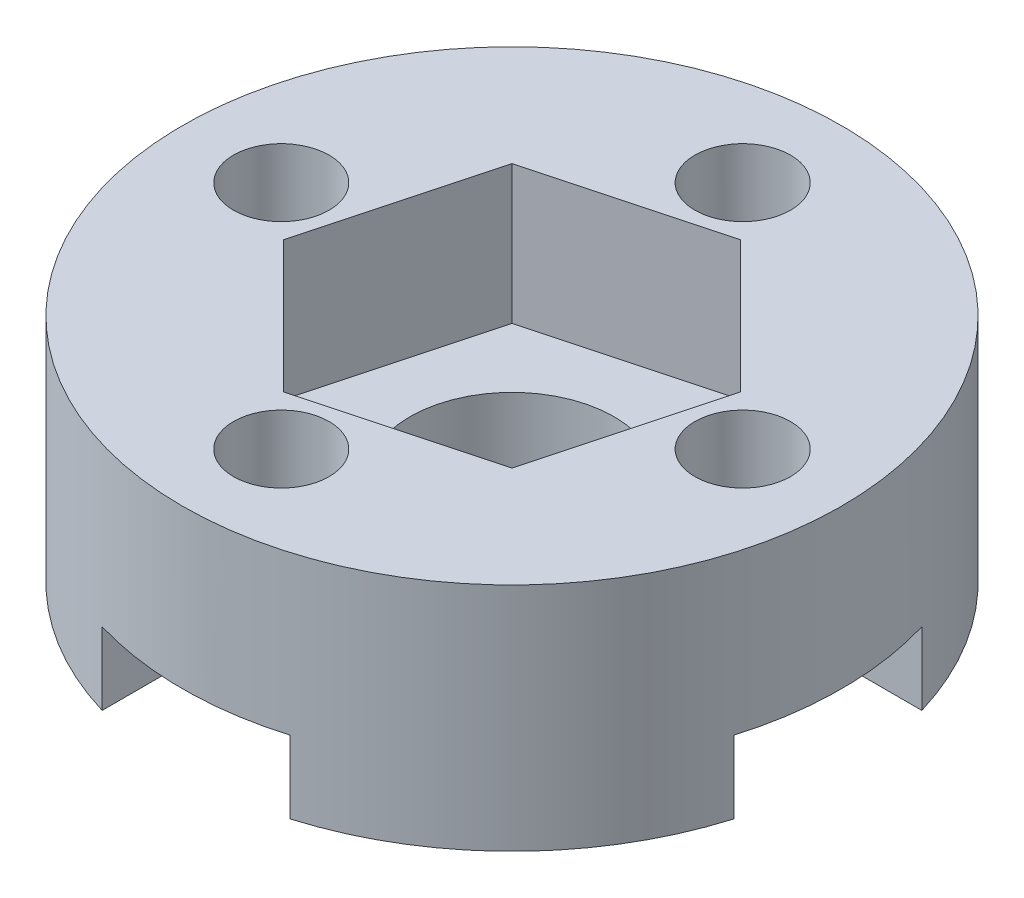
ISO-10303-21;
HEADER;
FILE_DESCRIPTION(('STEP AP214'),'2;1');
FILE_NAME('part.step','',(''),(''),'','','');
FILE_SCHEMA(('AUTOMOTIVE_DESIGN { 1 0 10303 214 1 1 1 1 }'));
ENDSEC;
DATA;
#1=APPLICATION_CONTEXT('core data for automotive mechanical design processes');
#2=APPLICATION_PROTOCOL_DEFINITION('international standard','automotive_design',2000,#1);
#3=PRODUCT_CONTEXT('',#1,'mechanical');
#4=PRODUCT('Part','Part','',(#3));
#5=PRODUCT_RELATED_PRODUCT_CATEGORY('part','',(#4));
#6=PRODUCT_DEFINITION_FORMATION('','',#4);
#7=PRODUCT_DEFINITION_CONTEXT('part definition',#1,'design');
#8=PRODUCT_DEFINITION('design','',#6,#7);
#9=PRODUCT_DEFINITION_SHAPE('','',#8);
#10=(LENGTH_UNIT() NAMED_UNIT(*) SI_UNIT(.MILLI.,.METRE.));
#11=(NAMED_UNIT(*) PLANE_ANGLE_UNIT() SI_UNIT($,.RADIAN.));
#12=(NAMED_UNIT(*) SI_UNIT($,.STERADIAN.) SOLID_ANGLE_UNIT());
#13=UNCERTAINTY_MEASURE_WITH_UNIT(LENGTH_MEASURE(1.E-05),#10,'distance_accuracy_value','');
#14=(GEOMETRIC_REPRESENTATION_CONTEXT(3) GLOBAL_UNCERTAINTY_ASSIGNED_CONTEXT((#13)) GLOBAL_UNIT_ASSIGNED_CONTEXT((#10,
#11,#12)) REPRESENTATION_CONTEXT('',''));
#15=CARTESIAN_POINT('',(0.,0.,0.));
#16=DIRECTION('',(0.,0.,1.));
#17=DIRECTION('',(1.,0.,0.));
#18=AXIS2_PLACEMENT_3D('',#15,#16,#17);
#19=CARTESIAN_POINT('',(0.,7.,0.));
#20=DIRECTION('',(0.,-1.,0.));
#21=DIRECTION('',(0.,0.,-1.));
#22=AXIS2_PLACEMENT_3D('',#19,#20,#21);
#23=CYLINDRICAL_SURFACE('',#22,3.1);
#24=CARTESIAN_POINT('',(0.,-1.,0.));
#25=DIRECTION('',(0.,-1.,0.));
#26=DIRECTION('',(0.,0.,-1.));
#27=AXIS2_PLACEMENT_3D('',#24,#25,#26);
#28=CIRCLE('',#27,3.1);
#29=CARTESIAN_POINT('',(0.,-1.,-3.1));
#30=VERTEX_POINT('',#29);
#31=EDGE_CURVE('E419',#30,#30,#28,.T.);
#32=ORIENTED_EDGE('',*,*,#31,.T.);
#33=EDGE_LOOP('',(#32));
#34=FACE_BOUND('',#33,.T.);
#35=CARTESIAN_POINT('',(0.,2.8,0.));
#36=DIRECTION('',(0.,1.,0.));
#37=DIRECTION('',(0.,0.,1.));
#38=AXIS2_PLACEMENT_3D('',#35,#36,#37);
#39=CIRCLE('',#38,3.1);
#40=CARTESIAN_POINT('',(0.,2.8,3.1));
#41=VERTEX_POINT('',#40);
#42=EDGE_CURVE('E39',#41,#41,#39,.T.);
#43=ORIENTED_EDGE('',*,*,#42,.T.);
#44=EDGE_LOOP('',(#43));
#45=FACE_BOUND('',#44,.T.);
#46=ADVANCED_FACE('F35',(#34,#45),#23,.F.);
#47=CARTESIAN_POINT('',(0.,0.,0.));
#48=DIRECTION('',(0.,1.,0.));
#49=DIRECTION('',(0.,0.,1.));
#50=AXIS2_PLACEMENT_3D('',#47,#48,#49);
#51=PLANE('',#50);
#52=DIRECTION('',(1.,0.,0.));
#53=VECTOR('',#52,1.);
#54=CARTESIAN_POINT('',(0.,0.,-2.85));
#55=LINE('',#54,#53);
#56=CARTESIAN_POINT('',(-9.58527516558604,0.,-2.8499999999999));
#57=VERTEX_POINT('',#56);
#58=CARTESIAN_POINT('',(-7.00000000000003,0.,-2.84999999999993));
#59=VERTEX_POINT('',#58);
#60=EDGE_CURVE('E417',#57,#59,#55,.T.);
#61=ORIENTED_EDGE('',*,*,#60,.F.);
#62=CARTESIAN_POINT('',(0.,0.,0.));
#63=DIRECTION('',(0.,1.,0.));
#64=DIRECTION('',(0.,0.,1.));
#65=AXIS2_PLACEMENT_3D('',#62,#63,#64);
#66=CIRCLE('',#65,10.);
#67=CARTESIAN_POINT('',(-2.85000000000007,0.,-9.58527516558599));
#68=VERTEX_POINT('',#67);
#69=EDGE_CURVE('E570',#68,#57,#66,.T.);
#70=ORIENTED_EDGE('',*,*,#69,.F.);
#71=DIRECTION('',(0.,0.,1.));
#72=VECTOR('',#71,1.);
#73=CARTESIAN_POINT('',(-2.85,0.,0.));
#74=LINE('',#73,#72);
#75=CARTESIAN_POINT('',(-2.85000000000005,0.,-6.99999999999998));
#76=VERTEX_POINT('',#75);
#77=EDGE_CURVE('E398',#68,#76,#74,.T.);
#78=ORIENTED_EDGE('',*,*,#77,.T.);
#79=CARTESIAN_POINT('',(0.,0.,-7.));
#80=DIRECTION('',(0.,1.,0.));
#81=DIRECTION('',(0.,0.,1.));
#82=AXIS2_PLACEMENT_3D('',#79,#80,#81);
#83=CIRCLE('',#82,2.85);
#84=CARTESIAN_POINT('',(-1.91425426413401,0.,-4.88857142857142));
#85=VERTEX_POINT('',#84);
#86=EDGE_CURVE('E387',#76,#85,#83,.T.);
#87=ORIENTED_EDGE('',*,*,#86,.T.);
#88=CARTESIAN_POINT('',(0.,0.,0.));
#89=DIRECTION('',(0.,1.,0.));
#90=DIRECTION('',(0.,0.,1.));
#91=AXIS2_PLACEMENT_3D('',#88,#89,#90);
#92=CIRCLE('',#91,5.25);
#93=CARTESIAN_POINT('',(-4.88857142857145,0.,-1.91425426413392));
#94=VERTEX_POINT('',#93);
#95=EDGE_CURVE('E452',#94,#85,#92,.F.);
#96=ORIENTED_EDGE('',*,*,#95,.F.);
#97=CARTESIAN_POINT('',(-7.,0.,0.));
#98=DIRECTION('',(0.,1.,0.));
#99=DIRECTION('',(0.,0.,1.));
#100=AXIS2_PLACEMENT_3D('',#97,#98,#99);
#101=CIRCLE('',#100,2.85);
#102=EDGE_CURVE('E394',#94,#59,#101,.T.);
#103=ORIENTED_EDGE('',*,*,#102,.T.);
#104=EDGE_LOOP('',(#61,#70,#78,#87,#96,#103));
#105=FACE_BOUND('',#104,.T.);
#106=ADVANCED_FACE('F569',(#105),#51,.F.);
#107=CARTESIAN_POINT('',(2.85,0.,9.58527516558601));
#108=VERTEX_POINT('',#107);
#109=CARTESIAN_POINT('',(9.58527516558602,0.,2.84999999999997));
#110=VERTEX_POINT('',#109);
#111=EDGE_CURVE('E444',#108,#110,#66,.T.);
#112=ORIENTED_EDGE('',*,*,#111,.F.);
#113=DIRECTION('',(0.,0.,-1.));
#114=VECTOR('',#113,1.);
#115=CARTESIAN_POINT('',(2.85,0.,0.));
#116=LINE('',#115,#114);
#117=CARTESIAN_POINT('',(2.85,0.,7.));
#118=VERTEX_POINT('',#117);
#119=EDGE_CURVE('E411',#108,#118,#116,.T.);
#120=ORIENTED_EDGE('',*,*,#119,.T.);
#121=CARTESIAN_POINT('',(0.,0.,7.));
#122=DIRECTION('',(0.,1.,0.));
#123=DIRECTION('',(0.,0.,1.));
#124=AXIS2_PLACEMENT_3D('',#121,#122,#123);
#125=CIRCLE('',#124,2.85);
#126=CARTESIAN_POINT('',(1.91425426413397,0.,4.88857142857143));
#127=VERTEX_POINT('',#126);
#128=EDGE_CURVE('E393',#118,#127,#125,.T.);
#129=ORIENTED_EDGE('',*,*,#128,.T.);
#130=CARTESIAN_POINT('',(4.88857142857144,0.,1.91425426413396));
#131=VERTEX_POINT('',#130);
#132=EDGE_CURVE('E443',#131,#127,#92,.F.);
#133=ORIENTED_EDGE('',*,*,#132,.F.);
#134=CARTESIAN_POINT('',(7.,0.,0.));
#135=DIRECTION('',(0.,1.,0.));
#136=DIRECTION('',(0.,0.,1.));
#137=AXIS2_PLACEMENT_3D('',#134,#135,#136);
#138=CIRCLE('',#137,2.85);
#139=CARTESIAN_POINT('',(7.00000000000001,0.,2.84999999999998));
#140=VERTEX_POINT('',#139);
#141=EDGE_CURVE('E60',#131,#140,#138,.T.);
#142=ORIENTED_EDGE('',*,*,#141,.T.);
#143=DIRECTION('',(-1.,0.,0.));
#144=VECTOR('',#143,1.);
#145=CARTESIAN_POINT('',(0.,0.,2.85));
#146=LINE('',#145,#144);
#147=EDGE_CURVE('E407',#110,#140,#146,.T.);
#148=ORIENTED_EDGE('',*,*,#147,.F.);
#149=EDGE_LOOP('',(#112,#120,#129,#133,#142,#148));
#150=FACE_BOUND('',#149,.T.);
#151=ADVANCED_FACE('F539',(#150),#51,.F.);
#152=CARTESIAN_POINT('',(-9.58527516558598,0.,2.8500000000001));
#153=VERTEX_POINT('',#152);
#154=CARTESIAN_POINT('',(-2.85,0.,9.58527516558601));
#155=VERTEX_POINT('',#154);
#156=EDGE_CURVE('E439',#153,#155,#66,.T.);
#157=ORIENTED_EDGE('',*,*,#156,.F.);
#158=DIRECTION('',(1.,0.,0.));
#159=VECTOR('',#158,1.);
#160=CARTESIAN_POINT('',(0.,0.,2.85));
#161=LINE('',#160,#159);
#162=CARTESIAN_POINT('',(-6.99999999999997,0.,2.85000000000007));
#163=VERTEX_POINT('',#162);
#164=EDGE_CURVE('E414',#153,#163,#161,.T.);
#165=ORIENTED_EDGE('',*,*,#164,.T.);
#166=CARTESIAN_POINT('',(-4.88857142857141,0.,1.91425426413403));
#167=VERTEX_POINT('',#166);
#168=EDGE_CURVE('E397',#163,#167,#101,.T.);
#169=ORIENTED_EDGE('',*,*,#168,.T.);
#170=CARTESIAN_POINT('',(-1.91425426413398,0.,4.88857142857143));
#171=VERTEX_POINT('',#170);
#172=EDGE_CURVE('E448',#171,#167,#92,.F.);
#173=ORIENTED_EDGE('',*,*,#172,.F.);
#174=CARTESIAN_POINT('',(-2.85,0.,7.));
#175=VERTEX_POINT('',#174);
#176=EDGE_CURVE('E390',#171,#175,#125,.T.);
#177=ORIENTED_EDGE('',*,*,#176,.T.);
#178=DIRECTION('',(0.,0.,-1.));
#179=VECTOR('',#178,1.);
#180=CARTESIAN_POINT('',(-2.85,0.,0.));
#181=LINE('',#180,#179);
#182=EDGE_CURVE('E409',#155,#175,#181,.T.);
#183=ORIENTED_EDGE('',*,*,#182,.F.);
#184=EDGE_LOOP('',(#157,#165,#169,#173,#177,#183));
#185=FACE_BOUND('',#184,.T.);
#186=ADVANCED_FACE('F556',(#185),#51,.F.);
#187=CARTESIAN_POINT('',(0.,7.,0.));
#188=DIRECTION('',(0.,-1.,0.));
#189=DIRECTION('',(0.,0.,-1.));
#190=AXIS2_PLACEMENT_3D('',#187,#188,#189);
#191=CYLINDRICAL_SURFACE('',#190,10.);
#192=CARTESIAN_POINT('',(0.,7.,0.));
#193=DIRECTION('',(0.,1.,0.));
#194=DIRECTION('',(0.,0.,1.));
#195=AXIS2_PLACEMENT_3D('',#192,#193,#194);
#196=CIRCLE('',#195,10.);
#197=CARTESIAN_POINT('',(0.,7.,10.));
#198=VERTEX_POINT('',#197);
#199=EDGE_CURVE('E440',#198,#198,#196,.T.);
#200=ORIENTED_EDGE('',*,*,#199,.F.);
#201=EDGE_LOOP('',(#200));
#202=FACE_BOUND('',#201,.T.);
#203=DIRECTION('',(0.,-1.,0.));
#204=VECTOR('',#203,1.);
#205=CARTESIAN_POINT('',(-9.58527516558604,2.2,-2.8499999999999));
#206=LINE('',#205,#204);
#207=CARTESIAN_POINT('',(-9.58527516558604,2.2,-2.8499999999999));
#208=VERTEX_POINT('',#207);
#209=EDGE_CURVE('E304',#208,#57,#206,.T.);
#210=ORIENTED_EDGE('',*,*,#209,.F.);
#211=CARTESIAN_POINT('',(0.,2.2,0.));
#212=DIRECTION('',(0.,-1.,0.));
#213=DIRECTION('',(0.,0.,-1.));
#214=AXIS2_PLACEMENT_3D('',#211,#212,#213);
#215=CIRCLE('',#214,10.);
#216=CARTESIAN_POINT('',(-9.58527516558598,2.2,2.8500000000001));
#217=VERTEX_POINT('',#216);
#218=EDGE_CURVE('E298',#217,#208,#215,.T.);
#219=ORIENTED_EDGE('',*,*,#218,.F.);
#220=DIRECTION('',(0.,-1.,0.));
#221=VECTOR('',#220,1.);
#222=CARTESIAN_POINT('',(-9.58527516558598,2.2,2.8500000000001));
#223=LINE('',#222,#221);
#224=EDGE_CURVE('E307',#217,#153,#223,.T.);
#225=ORIENTED_EDGE('',*,*,#224,.T.);
#226=ORIENTED_EDGE('',*,*,#156,.T.);
#227=DIRECTION('',(0.,-1.,0.));
#228=VECTOR('',#227,1.);
#229=CARTESIAN_POINT('',(-2.85,2.2,9.58527516558601));
#230=LINE('',#229,#228);
#231=CARTESIAN_POINT('',(-2.85,2.2,9.58527516558601));
#232=VERTEX_POINT('',#231);
#233=EDGE_CURVE('E335',#232,#155,#230,.T.);
#234=ORIENTED_EDGE('',*,*,#233,.F.);
#235=CARTESIAN_POINT('',(0.,2.2,0.));
#236=DIRECTION('',(0.,-1.,0.));
#237=DIRECTION('',(0.,0.,-1.));
#238=AXIS2_PLACEMENT_3D('',#235,#236,#237);
#239=CIRCLE('',#238,10.);
#240=CARTESIAN_POINT('',(2.85,2.2,9.58527516558601));
#241=VERTEX_POINT('',#240);
#242=EDGE_CURVE('E318',#241,#232,#239,.T.);
#243=ORIENTED_EDGE('',*,*,#242,.F.);
#244=DIRECTION('',(0.,-1.,0.));
#245=VECTOR('',#244,1.);
#246=CARTESIAN_POINT('',(2.85,2.2,9.58527516558601));
#247=LINE('',#246,#245);
#248=EDGE_CURVE('E327',#241,#108,#247,.T.);
#249=ORIENTED_EDGE('',*,*,#248,.T.);
#250=ORIENTED_EDGE('',*,*,#111,.T.);
#251=DIRECTION('',(0.,-1.,0.));
#252=VECTOR('',#251,1.);
#253=CARTESIAN_POINT('',(9.58527516558602,2.2,2.84999999999997));
#254=LINE('',#253,#252);
#255=CARTESIAN_POINT('',(9.58527516558602,2.2,2.84999999999997));
#256=VERTEX_POINT('',#255);
#257=EDGE_CURVE('E329',#256,#110,#254,.T.);
#258=ORIENTED_EDGE('',*,*,#257,.F.);
#259=CARTESIAN_POINT('',(0.,2.2,0.));
#260=DIRECTION('',(0.,-1.,0.));
#261=DIRECTION('',(0.,0.,-1.));
#262=AXIS2_PLACEMENT_3D('',#259,#260,#261);
#263=CIRCLE('',#262,10.);
#264=CARTESIAN_POINT('',(9.585275165586,2.2,-2.85000000000003));
#265=VERTEX_POINT('',#264);
#266=EDGE_CURVE('E348',#265,#256,#263,.T.);
#267=ORIENTED_EDGE('',*,*,#266,.F.);
#268=DIRECTION('',(0.,-1.,0.));
#269=VECTOR('',#268,1.);
#270=CARTESIAN_POINT('',(9.585275165586,2.2,-2.85000000000003));
#271=LINE('',#270,#269);
#272=CARTESIAN_POINT('',(9.585275165586,0.,-2.85000000000003));
#273=VERTEX_POINT('',#272);
#274=EDGE_CURVE('E355',#265,#273,#271,.T.);
#275=ORIENTED_EDGE('',*,*,#274,.T.);
#276=CARTESIAN_POINT('',(2.84999999999993,0.,-9.58527516558603));
#277=VERTEX_POINT('',#276);
#278=EDGE_CURVE('E447',#273,#277,#66,.T.);
#279=ORIENTED_EDGE('',*,*,#278,.T.);
#280=DIRECTION('',(0.,-1.,0.));
#281=VECTOR('',#280,1.);
#282=CARTESIAN_POINT('',(2.84999999999993,2.2,-9.58527516558603));
#283=LINE('',#282,#281);
#284=CARTESIAN_POINT('',(2.84999999999993,2.2,-9.58527516558603));
#285=VERTEX_POINT('',#284);
#286=EDGE_CURVE('E353',#285,#277,#283,.T.);
#287=ORIENTED_EDGE('',*,*,#286,.F.);
#288=CARTESIAN_POINT('',(0.,2.2,0.));
#289=DIRECTION('',(0.,-1.,0.));
#290=DIRECTION('',(0.,0.,-1.));
#291=AXIS2_PLACEMENT_3D('',#288,#289,#290);
#292=CIRCLE('',#291,10.);
#293=CARTESIAN_POINT('',(-2.85000000000007,2.2,-9.58527516558599));
#294=VERTEX_POINT('',#293);
#295=EDGE_CURVE('E371',#294,#285,#292,.T.);
#296=ORIENTED_EDGE('',*,*,#295,.F.);
#297=DIRECTION('',(0.,-1.,0.));
#298=VECTOR('',#297,1.);
#299=CARTESIAN_POINT('',(-2.85000000000007,2.2,-9.58527516558599));
#300=LINE('',#299,#298);
#301=EDGE_CURVE('E377',#294,#68,#300,.T.);
#302=ORIENTED_EDGE('',*,*,#301,.T.);
#303=ORIENTED_EDGE('',*,*,#69,.T.);
#304=EDGE_LOOP('',(#210,#219,#225,#226,#234,#243,#249,#250,#258,#267,#275,#279,#287,#296,#302,#303));
#305=FACE_BOUND('',#304,.T.);
#306=ADVANCED_FACE('F37',(#202,#305),#191,.T.);
#307=CARTESIAN_POINT('',(0.,7.,-7.));
#308=DIRECTION('',(0.,-1.,0.));
#309=DIRECTION('',(0.,0.,-1.));
#310=AXIS2_PLACEMENT_3D('',#307,#308,#309);
#311=CYLINDRICAL_SURFACE('',#310,1.45);
#312=CARTESIAN_POINT('',(0.,7.,-7.));
#313=DIRECTION('',(0.,1.,0.));
#314=DIRECTION('',(0.,0.,1.));
#315=AXIS2_PLACEMENT_3D('',#312,#313,#314);
#316=CIRCLE('',#315,1.45);
#317=CARTESIAN_POINT('',(0.,7.,-5.55));
#318=VERTEX_POINT('',#317);
#319=EDGE_CURVE('E436',#318,#318,#316,.T.);
#320=ORIENTED_EDGE('',*,*,#319,.T.);
#321=EDGE_LOOP('',(#320));
#322=FACE_BOUND('',#321,.T.);
#323=CARTESIAN_POINT('',(0.,2.2,-7.));
#324=DIRECTION('',(0.,-1.,0.));
#325=DIRECTION('',(0.,0.,-1.));
#326=AXIS2_PLACEMENT_3D('',#323,#324,#325);
#327=CIRCLE('',#326,1.45);
#328=CARTESIAN_POINT('',(0.,2.2,-8.45));
#329=VERTEX_POINT('',#328);
#330=EDGE_CURVE('E402',#329,#329,#327,.T.);
#331=ORIENTED_EDGE('',*,*,#330,.T.);
#332=EDGE_LOOP('',(#331));
#333=FACE_BOUND('',#332,.T.);
#334=ADVANCED_FACE('F482',(#322,#333),#311,.F.);
#335=CARTESIAN_POINT('',(7.,7.,0.));
#336=DIRECTION('',(0.,-1.,0.));
#337=DIRECTION('',(0.,0.,-1.));
#338=AXIS2_PLACEMENT_3D('',#335,#336,#337);
#339=CYLINDRICAL_SURFACE('',#338,1.45);
#340=CARTESIAN_POINT('',(7.,7.,0.));
#341=DIRECTION('',(0.,1.,0.));
#342=DIRECTION('',(0.,0.,1.));
#343=AXIS2_PLACEMENT_3D('',#340,#341,#342);
#344=CIRCLE('',#343,1.45);
#345=CARTESIAN_POINT('',(7.,7.,1.45));
#346=VERTEX_POINT('',#345);
#347=EDGE_CURVE('E433',#346,#346,#344,.T.);
#348=ORIENTED_EDGE('',*,*,#347,.T.);
#349=EDGE_LOOP('',(#348));
#350=FACE_BOUND('',#349,.T.);
#351=CARTESIAN_POINT('',(7.,2.2,0.));
#352=DIRECTION('',(0.,-1.,0.));
#353=DIRECTION('',(0.,0.,-1.));
#354=AXIS2_PLACEMENT_3D('',#351,#352,#353);
#355=CIRCLE('',#354,1.45);
#356=CARTESIAN_POINT('',(7.,2.2,-1.45));
#357=VERTEX_POINT('',#356);
#358=EDGE_CURVE('E477',#357,#357,#355,.T.);
#359=ORIENTED_EDGE('',*,*,#358,.T.);
#360=EDGE_LOOP('',(#359));
#361=FACE_BOUND('',#360,.T.);
#362=ADVANCED_FACE('F856',(#350,#361),#339,.F.);
#363=CARTESIAN_POINT('',(0.,7.,7.));
#364=DIRECTION('',(0.,-1.,0.));
#365=DIRECTION('',(0.,0.,-1.));
#366=AXIS2_PLACEMENT_3D('',#363,#364,#365);
#367=CYLINDRICAL_SURFACE('',#366,1.45);
#368=CARTESIAN_POINT('',(0.,7.,7.));
#369=DIRECTION('',(0.,1.,0.));
#370=DIRECTION('',(0.,0.,1.));
#371=AXIS2_PLACEMENT_3D('',#368,#369,#370);
#372=CIRCLE('',#371,1.45);
#373=CARTESIAN_POINT('',(0.,7.,8.45));
#374=VERTEX_POINT('',#373);
#375=EDGE_CURVE('E430',#374,#374,#372,.T.);
#376=ORIENTED_EDGE('',*,*,#375,.T.);
#377=EDGE_LOOP('',(#376));
#378=FACE_BOUND('',#377,.T.);
#379=CARTESIAN_POINT('',(0.,2.2,7.));
#380=DIRECTION('',(0.,-1.,0.));
#381=DIRECTION('',(0.,0.,-1.));
#382=AXIS2_PLACEMENT_3D('',#379,#380,#381);
#383=CIRCLE('',#382,1.45);
#384=CARTESIAN_POINT('',(0.,2.2,5.55));
#385=VERTEX_POINT('',#384);
#386=EDGE_CURVE('E474',#385,#385,#383,.T.);
#387=ORIENTED_EDGE('',*,*,#386,.T.);
#388=EDGE_LOOP('',(#387));
#389=FACE_BOUND('',#388,.T.);
#390=ADVANCED_FACE('F849',(#378,#389),#367,.F.);
#391=CARTESIAN_POINT('',(-7.,7.,0.));
#392=DIRECTION('',(0.,-1.,0.));
#393=DIRECTION('',(0.,0.,-1.));
#394=AXIS2_PLACEMENT_3D('',#391,#392,#393);
#395=CYLINDRICAL_SURFACE('',#394,1.45);
#396=CARTESIAN_POINT('',(-7.,7.,0.));
#397=DIRECTION('',(0.,1.,0.));
#398=DIRECTION('',(0.,0.,1.));
#399=AXIS2_PLACEMENT_3D('',#396,#397,#398);
#400=CIRCLE('',#399,1.45);
#401=CARTESIAN_POINT('',(-7.,7.,1.45));
#402=VERTEX_POINT('',#401);
#403=EDGE_CURVE('E426',#402,#402,#400,.T.);
#404=ORIENTED_EDGE('',*,*,#403,.T.);
#405=EDGE_LOOP('',(#404));
#406=FACE_BOUND('',#405,.T.);
#407=CARTESIAN_POINT('',(-7.,2.2,0.));
#408=DIRECTION('',(0.,-1.,0.));
#409=DIRECTION('',(0.,0.,-1.));
#410=AXIS2_PLACEMENT_3D('',#407,#408,#409);
#411=CIRCLE('',#410,1.45);
#412=CARTESIAN_POINT('',(-7.,2.2,-1.45));
#413=VERTEX_POINT('',#412);
#414=EDGE_CURVE('E471',#413,#413,#411,.T.);
#415=ORIENTED_EDGE('',*,*,#414,.T.);
#416=EDGE_LOOP('',(#415));
#417=FACE_BOUND('',#416,.T.);
#418=ADVANCED_FACE('F846',(#406,#417),#395,.F.);
#419=CARTESIAN_POINT('',(0.,-1.,0.));
#420=DIRECTION('',(0.,1.,0.));
#421=DIRECTION('',(0.,0.,1.));
#422=AXIS2_PLACEMENT_3D('',#419,#420,#421);
#423=CYLINDRICAL_SURFACE('',#422,5.25);
#424=ORIENTED_EDGE('',*,*,#172,.T.);
#425=DIRECTION('',(0.,-1.,0.));
#426=VECTOR('',#425,1.);
#427=CARTESIAN_POINT('',(-4.88857142857141,-0.5,1.91425426413403));
#428=LINE('',#427,#426);
#429=CARTESIAN_POINT('',(-4.88857142857141,-1.,1.91425426413403));
#430=VERTEX_POINT('',#429);
#431=EDGE_CURVE('E11',#167,#430,#428,.T.);
#432=ORIENTED_EDGE('',*,*,#431,.T.);
#433=CARTESIAN_POINT('',(0.,-1.,0.));
#434=DIRECTION('',(0.,-1.,0.));
#435=DIRECTION('',(0.,0.,-1.));
#436=AXIS2_PLACEMENT_3D('',#433,#434,#435);
#437=CIRCLE('',#436,5.25);
#438=CARTESIAN_POINT('',(-1.91425426413397,-1.,4.88857142857143));
#439=VERTEX_POINT('',#438);
#440=EDGE_CURVE('E563',#439,#430,#437,.T.);
#441=ORIENTED_EDGE('',*,*,#440,.F.);
#442=DIRECTION('',(0.,-1.,0.));
#443=VECTOR('',#442,1.);
#444=CARTESIAN_POINT('',(-1.91425426413397,-0.5,4.88857142857143));
#445=LINE('',#444,#443);
#446=EDGE_CURVE('E463',#439,#171,#445,.F.);
#447=ORIENTED_EDGE('',*,*,#446,.T.);
#448=EDGE_LOOP('',(#424,#432,#441,#447));
#449=FACE_BOUND('',#448,.T.);
#450=ADVANCED_FACE('F560',(#449),#423,.T.);
#451=ORIENTED_EDGE('',*,*,#132,.T.);
#452=DIRECTION('',(0.,-1.,0.));
#453=VECTOR('',#452,1.);
#454=CARTESIAN_POINT('',(1.91425426413397,-0.5,4.88857142857143));
#455=LINE('',#454,#453);
#456=CARTESIAN_POINT('',(1.91425426413398,-1.,4.88857142857143));
#457=VERTEX_POINT('',#456);
#458=EDGE_CURVE('E466',#127,#457,#455,.T.);
#459=ORIENTED_EDGE('',*,*,#458,.T.);
#460=CARTESIAN_POINT('',(4.88857142857144,-1.,1.91425426413396));
#461=VERTEX_POINT('',#460);
#462=EDGE_CURVE('E427',#461,#457,#437,.T.);
#463=ORIENTED_EDGE('',*,*,#462,.F.);
#464=DIRECTION('',(0.,-1.,0.));
#465=VECTOR('',#464,1.);
#466=CARTESIAN_POINT('',(4.88857142857144,-0.5,1.91425426413396));
#467=LINE('',#466,#465);
#468=EDGE_CURVE('E458',#461,#131,#467,.F.);
#469=ORIENTED_EDGE('',*,*,#468,.T.);
#470=EDGE_LOOP('',(#451,#459,#463,#469));
#471=FACE_BOUND('',#470,.T.);
#472=ADVANCED_FACE('F535',(#471),#423,.T.);
#473=CARTESIAN_POINT('',(1.91425426413394,0.,-4.88857142857144));
#474=VERTEX_POINT('',#473);
#475=CARTESIAN_POINT('',(4.88857142857142,0.,-1.91425426413399));
#476=VERTEX_POINT('',#475);
#477=EDGE_CURVE('E513',#474,#476,#92,.F.);
#478=ORIENTED_EDGE('',*,*,#477,.T.);
#479=DIRECTION('',(0.,-1.,0.));
#480=VECTOR('',#479,1.);
#481=CARTESIAN_POINT('',(4.88857142857142,-0.5,-1.91425426413399));
#482=LINE('',#481,#480);
#483=CARTESIAN_POINT('',(4.88857142857142,-1.,-1.91425426413399));
#484=VERTEX_POINT('',#483);
#485=EDGE_CURVE('E460',#476,#484,#482,.T.);
#486=ORIENTED_EDGE('',*,*,#485,.T.);
#487=CARTESIAN_POINT('',(1.91425426413394,-1.,-4.88857142857144));
#488=VERTEX_POINT('',#487);
#489=EDGE_CURVE('E423',#488,#484,#437,.T.);
#490=ORIENTED_EDGE('',*,*,#489,.F.);
#491=DIRECTION('',(0.,-1.,0.));
#492=VECTOR('',#491,1.);
#493=CARTESIAN_POINT('',(1.91425426413394,-0.5,-4.88857142857144));
#494=LINE('',#493,#492);
#495=EDGE_CURVE('E451',#488,#474,#494,.F.);
#496=ORIENTED_EDGE('',*,*,#495,.T.);
#497=EDGE_LOOP('',(#478,#486,#490,#496));
#498=FACE_BOUND('',#497,.T.);
#499=ADVANCED_FACE('F517',(#498),#423,.T.);
#500=ORIENTED_EDGE('',*,*,#278,.F.);
#501=DIRECTION('',(-1.,0.,0.));
#502=VECTOR('',#501,1.);
#503=CARTESIAN_POINT('',(0.,0.,-2.85));
#504=LINE('',#503,#502);
#505=CARTESIAN_POINT('',(6.99999999999999,0.,-2.85000000000003));
#506=VERTEX_POINT('',#505);
#507=EDGE_CURVE('E404',#273,#506,#504,.T.);
#508=ORIENTED_EDGE('',*,*,#507,.T.);
#509=EDGE_CURVE('E389',#506,#476,#138,.T.);
#510=ORIENTED_EDGE('',*,*,#509,.T.);
#511=ORIENTED_EDGE('',*,*,#477,.F.);
#512=CARTESIAN_POINT('',(2.84999999999995,0.,-7.00000000000002));
#513=VERTEX_POINT('',#512);
#514=EDGE_CURVE('E306',#474,#513,#83,.T.);
#515=ORIENTED_EDGE('',*,*,#514,.T.);
#516=DIRECTION('',(0.,0.,1.));
#517=VECTOR('',#516,1.);
#518=CARTESIAN_POINT('',(2.85,0.,0.));
#519=LINE('',#518,#517);
#520=EDGE_CURVE('E401',#277,#513,#519,.T.);
#521=ORIENTED_EDGE('',*,*,#520,.F.);
#522=EDGE_LOOP('',(#500,#508,#510,#511,#515,#521));
#523=FACE_BOUND('',#522,.T.);
#524=ADVANCED_FACE('F509',(#523),#51,.F.);
#525=CARTESIAN_POINT('',(0.,7.,0.));
#526=DIRECTION('',(0.,1.,0.));
#527=DIRECTION('',(0.,0.,1.));
#528=AXIS2_PLACEMENT_3D('',#525,#526,#527);
#529=PLANE('',#528);
#530=DIRECTION('',(-0.707106781186548,0.,-0.707106781186547));
#531=VECTOR('',#530,1.);
#532=CARTESIAN_POINT('',(5.46523985108701,7.,-1.46440660454116));
#533=LINE('',#532,#531);
#534=CARTESIAN_POINT('',(5.46523985108701,7.,-1.46440660454116));
#535=VERTEX_POINT('',#534);
#536=CARTESIAN_POINT('',(1.46440660454115,7.,-5.46523985108701));
#537=VERTEX_POINT('',#536);
#538=EDGE_CURVE('E52',#535,#537,#533,.T.);
#539=ORIENTED_EDGE('',*,*,#538,.F.);
#540=DIRECTION('',(0.25881904510252,0.,-0.965925826289069));
#541=VECTOR('',#540,1.);
#542=CARTESIAN_POINT('',(4.00083324654586,7.,4.00083324654585));
#543=LINE('',#542,#541);
#544=CARTESIAN_POINT('',(4.00083324654586,7.,4.00083324654585));
#545=VERTEX_POINT('',#544);
#546=EDGE_CURVE('E256',#545,#535,#543,.T.);
#547=ORIENTED_EDGE('',*,*,#546,.F.);
#548=DIRECTION('',(0.965925826289068,0.,-0.258819045102522));
#549=VECTOR('',#548,1.);
#550=CARTESIAN_POINT('',(-1.46440660454115,7.,5.46523985108701));
#551=LINE('',#550,#549);
#552=CARTESIAN_POINT('',(-1.46440660454115,7.,5.46523985108701));
#553=VERTEX_POINT('',#552);
#554=EDGE_CURVE('E259',#553,#545,#551,.T.);
#555=ORIENTED_EDGE('',*,*,#554,.F.);
#556=DIRECTION('',(0.707106781186548,0.,0.707106781186547));
#557=VECTOR('',#556,1.);
#558=CARTESIAN_POINT('',(-5.46523985108701,7.,1.46440660454116));
#559=LINE('',#558,#557);
#560=CARTESIAN_POINT('',(-5.46523985108701,7.,1.46440660454116));
#561=VERTEX_POINT('',#560);
#562=EDGE_CURVE('E275',#561,#553,#559,.T.);
#563=ORIENTED_EDGE('',*,*,#562,.F.);
#564=DIRECTION('',(-0.25881904510252,0.,0.965925826289069));
#565=VECTOR('',#564,1.);
#566=CARTESIAN_POINT('',(-4.00083324654586,7.,-4.00083324654585));
#567=LINE('',#566,#565);
#568=CARTESIAN_POINT('',(-4.00083324654586,7.,-4.00083324654585));
#569=VERTEX_POINT('',#568);
#570=EDGE_CURVE('E272',#569,#561,#567,.T.);
#571=ORIENTED_EDGE('',*,*,#570,.F.);
#572=DIRECTION('',(-0.965925826289068,0.,0.258819045102522));
#573=VECTOR('',#572,1.);
#574=CARTESIAN_POINT('',(1.46440660454115,7.,-5.46523985108702));
#575=LINE('',#574,#573);
#576=EDGE_CURVE('E270',#537,#569,#575,.T.);
#577=ORIENTED_EDGE('',*,*,#576,.F.);
#578=EDGE_LOOP('',(#539,#547,#555,#563,#571,#577));
#579=FACE_BOUND('',#578,.T.);
#580=ORIENTED_EDGE('',*,*,#375,.F.);
#581=EDGE_LOOP('',(#580));
#582=FACE_BOUND('',#581,.T.);
#583=ORIENTED_EDGE('',*,*,#319,.F.);
#584=EDGE_LOOP('',(#583));
#585=FACE_BOUND('',#584,.T.);
#586=ORIENTED_EDGE('',*,*,#199,.T.);
#587=EDGE_LOOP('',(#586));
#588=FACE_BOUND('',#587,.T.);
#589=ORIENTED_EDGE('',*,*,#347,.F.);
#590=EDGE_LOOP('',(#589));
#591=FACE_BOUND('',#590,.T.);
#592=ORIENTED_EDGE('',*,*,#403,.F.);
#593=EDGE_LOOP('',(#592));
#594=FACE_BOUND('',#593,.T.);
#595=ADVANCED_FACE('F601',(#579,#582,#585,#588,#591,#594),#529,.T.);
#596=CARTESIAN_POINT('',(0.,-1.,0.));
#597=DIRECTION('',(0.,-1.,0.));
#598=DIRECTION('',(0.,0.,-1.));
#599=AXIS2_PLACEMENT_3D('',#596,#597,#598);
#600=PLANE('',#599);
#601=CARTESIAN_POINT('',(-7.,-1.,0.));
#602=DIRECTION('',(0.,-1.,0.));
#603=DIRECTION('',(0.,0.,-1.));
#604=AXIS2_PLACEMENT_3D('',#601,#602,#603);
#605=CIRCLE('',#604,2.85);
#606=CARTESIAN_POINT('',(-4.88857142857145,-1.,-1.91425426413392));
#607=VERTEX_POINT('',#606);
#608=EDGE_CURVE('E292',#607,#430,#605,.T.);
#609=ORIENTED_EDGE('',*,*,#608,.F.);
#610=CARTESIAN_POINT('',(-1.91425426413401,-1.,-4.88857142857141));
#611=VERTEX_POINT('',#610);
#612=EDGE_CURVE('E422',#607,#611,#437,.T.);
#613=ORIENTED_EDGE('',*,*,#612,.T.);
#614=CARTESIAN_POINT('',(0.,-1.,-7.));
#615=DIRECTION('',(0.,-1.,0.));
#616=DIRECTION('',(0.,0.,-1.));
#617=AXIS2_PLACEMENT_3D('',#614,#615,#616);
#618=CIRCLE('',#617,2.85);
#619=EDGE_CURVE('E365',#488,#611,#618,.T.);
#620=ORIENTED_EDGE('',*,*,#619,.F.);
#621=ORIENTED_EDGE('',*,*,#489,.T.);
#622=CARTESIAN_POINT('',(7.,-1.,0.));
#623=DIRECTION('',(0.,-1.,0.));
#624=DIRECTION('',(0.,0.,-1.));
#625=AXIS2_PLACEMENT_3D('',#622,#623,#624);
#626=CIRCLE('',#625,2.85);
#627=EDGE_CURVE('E342',#461,#484,#626,.T.);
#628=ORIENTED_EDGE('',*,*,#627,.F.);
#629=ORIENTED_EDGE('',*,*,#462,.T.);
#630=CARTESIAN_POINT('',(0.,-1.,7.));
#631=DIRECTION('',(0.,-1.,0.));
#632=DIRECTION('',(0.,0.,-1.));
#633=AXIS2_PLACEMENT_3D('',#630,#631,#632);
#634=CIRCLE('',#633,2.85);
#635=EDGE_CURVE('E319',#439,#457,#634,.T.);
#636=ORIENTED_EDGE('',*,*,#635,.F.);
#637=ORIENTED_EDGE('',*,*,#440,.T.);
#638=EDGE_LOOP('',(#609,#613,#620,#621,#628,#629,#636,#637));
#639=FACE_BOUND('',#638,.T.);
#640=ORIENTED_EDGE('',*,*,#31,.F.);
#641=EDGE_LOOP('',(#640));
#642=FACE_BOUND('',#641,.T.);
#643=ADVANCED_FACE('F521',(#639,#642),#600,.T.);
#644=ORIENTED_EDGE('',*,*,#612,.F.);
#645=DIRECTION('',(0.,-1.,0.));
#646=VECTOR('',#645,1.);
#647=CARTESIAN_POINT('',(-4.88857142857145,-0.5,-1.91425426413392));
#648=LINE('',#647,#646);
#649=EDGE_CURVE('E44',#607,#94,#648,.F.);
#650=ORIENTED_EDGE('',*,*,#649,.T.);
#651=ORIENTED_EDGE('',*,*,#95,.T.);
#652=DIRECTION('',(0.,-1.,0.));
#653=VECTOR('',#652,1.);
#654=CARTESIAN_POINT('',(-1.91425426413401,-0.5,-4.88857142857141));
#655=LINE('',#654,#653);
#656=EDGE_CURVE('E455',#85,#611,#655,.T.);
#657=ORIENTED_EDGE('',*,*,#656,.T.);
#658=EDGE_LOOP('',(#644,#650,#651,#657));
#659=FACE_BOUND('',#658,.T.);
#660=ADVANCED_FACE('F529',(#659),#423,.T.);
#661=CARTESIAN_POINT('',(2.85,2.2,0.));
#662=DIRECTION('',(-1.,0.,0.));
#663=DIRECTION('',(0.,0.,1.));
#664=AXIS2_PLACEMENT_3D('',#661,#662,#663);
#665=PLANE('',#664);
#666=ORIENTED_EDGE('',*,*,#520,.T.);
#667=DIRECTION('',(0.,-1.,0.));
#668=VECTOR('',#667,1.);
#669=CARTESIAN_POINT('',(2.84999999999995,2.2,-7.00000000000002));
#670=LINE('',#669,#668);
#671=CARTESIAN_POINT('',(2.84999999999995,2.2,-7.00000000000002));
#672=VERTEX_POINT('',#671);
#673=EDGE_CURVE('E374',#672,#513,#670,.T.);
#674=ORIENTED_EDGE('',*,*,#673,.F.);
#675=DIRECTION('',(0.,0.,-1.));
#676=VECTOR('',#675,1.);
#677=CARTESIAN_POINT('',(2.85,2.2,0.));
#678=LINE('',#677,#676);
#679=EDGE_CURVE('E362',#672,#285,#678,.T.);
#680=ORIENTED_EDGE('',*,*,#679,.T.);
#681=ORIENTED_EDGE('',*,*,#286,.T.);
#682=EDGE_LOOP('',(#666,#674,#680,#681));
#683=FACE_BOUND('',#682,.T.);
#684=ADVANCED_FACE('F507',(#683),#665,.T.);
#685=CARTESIAN_POINT('',(-2.85,2.2,0.));
#686=DIRECTION('',(-1.,0.,0.));
#687=DIRECTION('',(0.,0.,1.));
#688=AXIS2_PLACEMENT_3D('',#685,#686,#687);
#689=PLANE('',#688);
#690=ORIENTED_EDGE('',*,*,#301,.F.);
#691=DIRECTION('',(0.,0.,-1.));
#692=VECTOR('',#691,1.);
#693=CARTESIAN_POINT('',(-2.85,2.2,0.));
#694=LINE('',#693,#692);
#695=CARTESIAN_POINT('',(-2.85000000000005,2.2,-6.99999999999998));
#696=VERTEX_POINT('',#695);
#697=EDGE_CURVE('E368',#696,#294,#694,.T.);
#698=ORIENTED_EDGE('',*,*,#697,.F.);
#699=DIRECTION('',(0.,-1.,0.));
#700=VECTOR('',#699,1.);
#701=CARTESIAN_POINT('',(-2.85000000000005,2.2,-6.99999999999998));
#702=LINE('',#701,#700);
#703=EDGE_CURVE('E380',#696,#76,#702,.T.);
#704=ORIENTED_EDGE('',*,*,#703,.T.);
#705=ORIENTED_EDGE('',*,*,#77,.F.);
#706=EDGE_LOOP('',(#690,#698,#704,#705));
#707=FACE_BOUND('',#706,.T.);
#708=ADVANCED_FACE('F499',(#707),#689,.F.);
#709=CARTESIAN_POINT('',(0.,2.2,-7.));
#710=DIRECTION('',(0.,-1.,0.));
#711=DIRECTION('',(0.,0.,-1.));
#712=AXIS2_PLACEMENT_3D('',#709,#710,#711);
#713=CYLINDRICAL_SURFACE('',#712,2.85);
#714=ORIENTED_EDGE('',*,*,#703,.F.);
#715=CARTESIAN_POINT('',(0.,2.2,-7.));
#716=DIRECTION('',(0.,-1.,0.));
#717=DIRECTION('',(0.,0.,-1.));
#718=AXIS2_PLACEMENT_3D('',#715,#716,#717);
#719=CIRCLE('',#718,2.85);
#720=EDGE_CURVE('E364',#672,#696,#719,.T.);
#721=ORIENTED_EDGE('',*,*,#720,.F.);
#722=ORIENTED_EDGE('',*,*,#673,.T.);
#723=ORIENTED_EDGE('',*,*,#514,.F.);
#724=ORIENTED_EDGE('',*,*,#495,.F.);
#725=ORIENTED_EDGE('',*,*,#619,.T.);
#726=ORIENTED_EDGE('',*,*,#656,.F.);
#727=ORIENTED_EDGE('',*,*,#86,.F.);
#728=EDGE_LOOP('',(#714,#721,#722,#723,#724,#725,#726,#727));
#729=FACE_BOUND('',#728,.T.);
#730=ADVANCED_FACE('F488',(#729),#713,.F.);
#731=CARTESIAN_POINT('',(0.,2.2,0.));
#732=DIRECTION('',(0.,-1.,0.));
#733=DIRECTION('',(0.,0.,-1.));
#734=AXIS2_PLACEMENT_3D('',#731,#732,#733);
#735=PLANE('',#734);
#736=ORIENTED_EDGE('',*,*,#330,.F.);
#737=EDGE_LOOP('',(#736));
#738=FACE_BOUND('',#737,.T.);
#739=ORIENTED_EDGE('',*,*,#679,.F.);
#740=ORIENTED_EDGE('',*,*,#720,.T.);
#741=ORIENTED_EDGE('',*,*,#697,.T.);
#742=ORIENTED_EDGE('',*,*,#295,.T.);
#743=EDGE_LOOP('',(#739,#740,#741,#742));
#744=FACE_BOUND('',#743,.T.);
#745=ADVANCED_FACE('F484',(#738,#744),#735,.T.);
#746=CARTESIAN_POINT('',(0.,2.2,2.85));
#747=DIRECTION('',(0.,0.,-1.));
#748=DIRECTION('',(-1.,0.,0.));
#749=AXIS2_PLACEMENT_3D('',#746,#747,#748);
#750=PLANE('',#749);
#751=ORIENTED_EDGE('',*,*,#147,.T.);
#752=DIRECTION('',(0.,-1.,0.));
#753=VECTOR('',#752,1.);
#754=CARTESIAN_POINT('',(7.00000000000001,2.2,2.84999999999998));
#755=LINE('',#754,#753);
#756=CARTESIAN_POINT('',(7.00000000000001,2.2,2.84999999999998));
#757=VERTEX_POINT('',#756);
#758=EDGE_CURVE('E351',#757,#140,#755,.T.);
#759=ORIENTED_EDGE('',*,*,#758,.F.);
#760=DIRECTION('',(1.,0.,0.));
#761=VECTOR('',#760,1.);
#762=CARTESIAN_POINT('',(0.,2.2,2.85));
#763=LINE('',#762,#761);
#764=EDGE_CURVE('E339',#757,#256,#763,.T.);
#765=ORIENTED_EDGE('',*,*,#764,.T.);
#766=ORIENTED_EDGE('',*,*,#257,.T.);
#767=EDGE_LOOP('',(#751,#759,#765,#766));
#768=FACE_BOUND('',#767,.T.);
#769=ADVANCED_FACE('F487',(#768),#750,.T.);
#770=CARTESIAN_POINT('',(0.,2.2,-2.85));
#771=DIRECTION('',(0.,0.,-1.));
#772=DIRECTION('',(-1.,0.,0.));
#773=AXIS2_PLACEMENT_3D('',#770,#771,#772);
#774=PLANE('',#773);
#775=ORIENTED_EDGE('',*,*,#274,.F.);
#776=DIRECTION('',(1.,0.,0.));
#777=VECTOR('',#776,1.);
#778=CARTESIAN_POINT('',(0.,2.2,-2.85));
#779=LINE('',#778,#777);
#780=CARTESIAN_POINT('',(6.99999999999999,2.2,-2.85000000000003));
#781=VERTEX_POINT('',#780);
#782=EDGE_CURVE('E345',#781,#265,#779,.T.);
#783=ORIENTED_EDGE('',*,*,#782,.F.);
#784=DIRECTION('',(0.,-1.,0.));
#785=VECTOR('',#784,1.);
#786=CARTESIAN_POINT('',(6.99999999999999,2.2,-2.85000000000003));
#787=LINE('',#786,#785);
#788=EDGE_CURVE('E358',#781,#506,#787,.T.);
#789=ORIENTED_EDGE('',*,*,#788,.T.);
#790=ORIENTED_EDGE('',*,*,#507,.F.);
#791=EDGE_LOOP('',(#775,#783,#789,#790));
#792=FACE_BOUND('',#791,.T.);
#793=ADVANCED_FACE('F664',(#792),#774,.F.);
#794=CARTESIAN_POINT('',(7.,2.2,0.));
#795=DIRECTION('',(0.,-1.,0.));
#796=DIRECTION('',(0.,0.,-1.));
#797=AXIS2_PLACEMENT_3D('',#794,#795,#796);
#798=CYLINDRICAL_SURFACE('',#797,2.85);
#799=ORIENTED_EDGE('',*,*,#788,.F.);
#800=CARTESIAN_POINT('',(7.,2.2,0.));
#801=DIRECTION('',(0.,-1.,0.));
#802=DIRECTION('',(0.,0.,-1.));
#803=AXIS2_PLACEMENT_3D('',#800,#801,#802);
#804=CIRCLE('',#803,2.85);
#805=EDGE_CURVE('E341',#757,#781,#804,.T.);
#806=ORIENTED_EDGE('',*,*,#805,.F.);
#807=ORIENTED_EDGE('',*,*,#758,.T.);
#808=ORIENTED_EDGE('',*,*,#141,.F.);
#809=ORIENTED_EDGE('',*,*,#468,.F.);
#810=ORIENTED_EDGE('',*,*,#627,.T.);
#811=ORIENTED_EDGE('',*,*,#485,.F.);
#812=ORIENTED_EDGE('',*,*,#509,.F.);
#813=EDGE_LOOP('',(#799,#806,#807,#808,#809,#810,#811,#812));
#814=FACE_BOUND('',#813,.T.);
#815=ADVANCED_FACE('F673',(#814),#798,.F.);
#816=CARTESIAN_POINT('',(0.,2.2,0.));
#817=DIRECTION('',(0.,-1.,0.));
#818=DIRECTION('',(0.,0.,-1.));
#819=AXIS2_PLACEMENT_3D('',#816,#817,#818);
#820=PLANE('',#819);
#821=ORIENTED_EDGE('',*,*,#358,.F.);
#822=EDGE_LOOP('',(#821));
#823=FACE_BOUND('',#822,.T.);
#824=ORIENTED_EDGE('',*,*,#764,.F.);
#825=ORIENTED_EDGE('',*,*,#805,.T.);
#826=ORIENTED_EDGE('',*,*,#782,.T.);
#827=ORIENTED_EDGE('',*,*,#266,.T.);
#828=EDGE_LOOP('',(#824,#825,#826,#827));
#829=FACE_BOUND('',#828,.T.);
#830=ADVANCED_FACE('F682',(#823,#829),#820,.T.);
#831=CARTESIAN_POINT('',(2.85,2.2,0.));
#832=DIRECTION('',(1.,0.,0.));
#833=DIRECTION('',(0.,0.,-1.));
#834=AXIS2_PLACEMENT_3D('',#831,#832,#833);
#835=PLANE('',#834);
#836=ORIENTED_EDGE('',*,*,#248,.F.);
#837=DIRECTION('',(0.,0.,1.));
#838=VECTOR('',#837,1.);
#839=CARTESIAN_POINT('',(2.85,2.2,0.));
#840=LINE('',#839,#838);
#841=CARTESIAN_POINT('',(2.85,2.2,7.));
#842=VERTEX_POINT('',#841);
#843=EDGE_CURVE('E315',#842,#241,#840,.T.);
#844=ORIENTED_EDGE('',*,*,#843,.F.);
#845=DIRECTION('',(0.,-1.,0.));
#846=VECTOR('',#845,1.);
#847=CARTESIAN_POINT('',(2.85,2.2,7.));
#848=LINE('',#847,#846);
#849=EDGE_CURVE('E303',#842,#118,#848,.T.);
#850=ORIENTED_EDGE('',*,*,#849,.T.);
#851=ORIENTED_EDGE('',*,*,#119,.F.);
#852=EDGE_LOOP('',(#836,#844,#850,#851));
#853=FACE_BOUND('',#852,.T.);
#854=ADVANCED_FACE('F546',(#853),#835,.F.);
#855=CARTESIAN_POINT('',(-2.85,2.2,0.));
#856=DIRECTION('',(1.,0.,0.));
#857=DIRECTION('',(0.,0.,-1.));
#858=AXIS2_PLACEMENT_3D('',#855,#856,#857);
#859=PLANE('',#858);
#860=ORIENTED_EDGE('',*,*,#182,.T.);
#861=DIRECTION('',(0.,-1.,0.));
#862=VECTOR('',#861,1.);
#863=CARTESIAN_POINT('',(-2.85,2.2,7.));
#864=LINE('',#863,#862);
#865=CARTESIAN_POINT('',(-2.85,2.2,7.));
#866=VERTEX_POINT('',#865);
#867=EDGE_CURVE('E332',#866,#175,#864,.T.);
#868=ORIENTED_EDGE('',*,*,#867,.F.);
#869=DIRECTION('',(0.,0.,1.));
#870=VECTOR('',#869,1.);
#871=CARTESIAN_POINT('',(-2.85,2.2,0.));
#872=LINE('',#871,#870);
#873=EDGE_CURVE('E322',#866,#232,#872,.T.);
#874=ORIENTED_EDGE('',*,*,#873,.T.);
#875=ORIENTED_EDGE('',*,*,#233,.T.);
#876=EDGE_LOOP('',(#860,#868,#874,#875));
#877=FACE_BOUND('',#876,.T.);
#878=ADVANCED_FACE('F701',(#877),#859,.T.);
#879=CARTESIAN_POINT('',(0.,2.2,7.));
#880=DIRECTION('',(0.,-1.,0.));
#881=DIRECTION('',(0.,0.,-1.));
#882=AXIS2_PLACEMENT_3D('',#879,#880,#881);
#883=CYLINDRICAL_SURFACE('',#882,2.85);
#884=ORIENTED_EDGE('',*,*,#849,.F.);
#885=CARTESIAN_POINT('',(0.,2.2,7.));
#886=DIRECTION('',(0.,-1.,0.));
#887=DIRECTION('',(0.,0.,-1.));
#888=AXIS2_PLACEMENT_3D('',#885,#886,#887);
#889=CIRCLE('',#888,2.85);
#890=EDGE_CURVE('E324',#866,#842,#889,.T.);
#891=ORIENTED_EDGE('',*,*,#890,.F.);
#892=ORIENTED_EDGE('',*,*,#867,.T.);
#893=ORIENTED_EDGE('',*,*,#176,.F.);
#894=ORIENTED_EDGE('',*,*,#446,.F.);
#895=ORIENTED_EDGE('',*,*,#635,.T.);
#896=ORIENTED_EDGE('',*,*,#458,.F.);
#897=ORIENTED_EDGE('',*,*,#128,.F.);
#898=EDGE_LOOP('',(#884,#891,#892,#893,#894,#895,#896,#897));
#899=FACE_BOUND('',#898,.T.);
#900=ADVANCED_FACE('F542',(#899),#883,.F.);
#901=CARTESIAN_POINT('',(0.,2.2,0.));
#902=DIRECTION('',(0.,-1.,0.));
#903=DIRECTION('',(0.,0.,-1.));
#904=AXIS2_PLACEMENT_3D('',#901,#902,#903);
#905=PLANE('',#904);
#906=ORIENTED_EDGE('',*,*,#386,.F.);
#907=EDGE_LOOP('',(#906));
#908=FACE_BOUND('',#907,.T.);
#909=ORIENTED_EDGE('',*,*,#843,.T.);
#910=ORIENTED_EDGE('',*,*,#242,.T.);
#911=ORIENTED_EDGE('',*,*,#873,.F.);
#912=ORIENTED_EDGE('',*,*,#890,.T.);
#913=EDGE_LOOP('',(#909,#910,#911,#912));
#914=FACE_BOUND('',#913,.T.);
#915=ADVANCED_FACE('F550',(#908,#914),#905,.T.);
#916=CARTESIAN_POINT('',(0.,2.2,-2.85));
#917=DIRECTION('',(0.,0.,1.));
#918=DIRECTION('',(1.,0.,0.));
#919=AXIS2_PLACEMENT_3D('',#916,#917,#918);
#920=PLANE('',#919);
#921=ORIENTED_EDGE('',*,*,#60,.T.);
#922=DIRECTION('',(0.,-1.,0.));
#923=VECTOR('',#922,1.);
#924=CARTESIAN_POINT('',(-7.00000000000003,2.2,-2.84999999999993));
#925=LINE('',#924,#923);
#926=CARTESIAN_POINT('',(-7.00000000000003,2.2,-2.84999999999993));
#927=VERTEX_POINT('',#926);
#928=EDGE_CURVE('E301',#927,#59,#925,.T.);
#929=ORIENTED_EDGE('',*,*,#928,.F.);
#930=DIRECTION('',(-1.,0.,0.));
#931=VECTOR('',#930,1.);
#932=CARTESIAN_POINT('',(0.,2.2,-2.85));
#933=LINE('',#932,#931);
#934=EDGE_CURVE('E289',#927,#208,#933,.T.);
#935=ORIENTED_EDGE('',*,*,#934,.T.);
#936=ORIENTED_EDGE('',*,*,#209,.T.);
#937=EDGE_LOOP('',(#921,#929,#935,#936));
#938=FACE_BOUND('',#937,.T.);
#939=ADVANCED_FACE('F580',(#938),#920,.T.);
#940=CARTESIAN_POINT('',(0.,2.2,2.85));
#941=DIRECTION('',(0.,0.,1.));
#942=DIRECTION('',(1.,0.,0.));
#943=AXIS2_PLACEMENT_3D('',#940,#941,#942);
#944=PLANE('',#943);
#945=ORIENTED_EDGE('',*,*,#224,.F.);
#946=DIRECTION('',(-1.,0.,0.));
#947=VECTOR('',#946,1.);
#948=CARTESIAN_POINT('',(0.,2.2,2.85));
#949=LINE('',#948,#947);
#950=CARTESIAN_POINT('',(-6.99999999999997,2.2,2.85000000000007));
#951=VERTEX_POINT('',#950);
#952=EDGE_CURVE('E295',#951,#217,#949,.T.);
#953=ORIENTED_EDGE('',*,*,#952,.F.);
#954=DIRECTION('',(0.,-1.,0.));
#955=VECTOR('',#954,1.);
#956=CARTESIAN_POINT('',(-6.99999999999997,2.2,2.85000000000007));
#957=LINE('',#956,#955);
#958=EDGE_CURVE('E310',#951,#163,#957,.T.);
#959=ORIENTED_EDGE('',*,*,#958,.T.);
#960=ORIENTED_EDGE('',*,*,#164,.F.);
#961=EDGE_LOOP('',(#945,#953,#959,#960));
#962=FACE_BOUND('',#961,.T.);
#963=ADVANCED_FACE('F575',(#962),#944,.F.);
#964=CARTESIAN_POINT('',(-7.,2.2,0.));
#965=DIRECTION('',(0.,-1.,0.));
#966=DIRECTION('',(0.,0.,-1.));
#967=AXIS2_PLACEMENT_3D('',#964,#965,#966);
#968=CYLINDRICAL_SURFACE('',#967,2.85);
#969=ORIENTED_EDGE('',*,*,#958,.F.);
#970=CARTESIAN_POINT('',(-7.,2.2,0.));
#971=DIRECTION('',(0.,-1.,0.));
#972=DIRECTION('',(0.,0.,-1.));
#973=AXIS2_PLACEMENT_3D('',#970,#971,#972);
#974=CIRCLE('',#973,2.85);
#975=EDGE_CURVE('E291',#927,#951,#974,.T.);
#976=ORIENTED_EDGE('',*,*,#975,.F.);
#977=ORIENTED_EDGE('',*,*,#928,.T.);
#978=ORIENTED_EDGE('',*,*,#102,.F.);
#979=ORIENTED_EDGE('',*,*,#649,.F.);
#980=ORIENTED_EDGE('',*,*,#608,.T.);
#981=ORIENTED_EDGE('',*,*,#431,.F.);
#982=ORIENTED_EDGE('',*,*,#168,.F.);
#983=EDGE_LOOP('',(#969,#976,#977,#978,#979,#980,#981,#982));
#984=FACE_BOUND('',#983,.T.);
#985=ADVANCED_FACE('F566',(#984),#968,.F.);
#986=CARTESIAN_POINT('',(0.,2.2,0.));
#987=DIRECTION('',(0.,-1.,0.));
#988=DIRECTION('',(0.,0.,-1.));
#989=AXIS2_PLACEMENT_3D('',#986,#987,#988);
#990=PLANE('',#989);
#991=ORIENTED_EDGE('',*,*,#414,.F.);
#992=EDGE_LOOP('',(#991));
#993=FACE_BOUND('',#992,.T.);
#994=ORIENTED_EDGE('',*,*,#934,.F.);
#995=ORIENTED_EDGE('',*,*,#975,.T.);
#996=ORIENTED_EDGE('',*,*,#952,.T.);
#997=ORIENTED_EDGE('',*,*,#218,.T.);
#998=EDGE_LOOP('',(#994,#995,#996,#997));
#999=FACE_BOUND('',#998,.T.);
#1000=ADVANCED_FACE('F579',(#993,#999),#990,.T.);
#1001=CARTESIAN_POINT('',(5.46523985108701,2.8,-1.46440660454116));
#1002=DIRECTION('',(0.707106781186547,0.,-0.707106781186548));
#1003=DIRECTION('',(-0.707106781186548,0.,-0.707106781186547));
#1004=AXIS2_PLACEMENT_3D('',#1001,#1002,#1003);
#1005=PLANE('',#1004);
#1006=ORIENTED_EDGE('',*,*,#538,.T.);
#1007=DIRECTION('',(0.,1.,0.));
#1008=VECTOR('',#1007,1.);
#1009=CARTESIAN_POINT('',(1.46440660454115,2.8,-5.46523985108702));
#1010=LINE('',#1009,#1008);
#1011=CARTESIAN_POINT('',(1.46440660454115,2.8,-5.46523985108702));
#1012=VERTEX_POINT('',#1011);
#1013=EDGE_CURVE('E233',#1012,#537,#1010,.T.);
#1014=ORIENTED_EDGE('',*,*,#1013,.F.);
#1015=DIRECTION('',(-0.707106781186548,0.,-0.707106781186547));
#1016=VECTOR('',#1015,1.);
#1017=CARTESIAN_POINT('',(5.46523985108701,2.8,-1.46440660454116));
#1018=LINE('',#1017,#1016);
#1019=CARTESIAN_POINT('',(5.46523985108701,2.8,-1.46440660454116));
#1020=VERTEX_POINT('',#1019);
#1021=EDGE_CURVE('E237',#1020,#1012,#1018,.T.);
#1022=ORIENTED_EDGE('',*,*,#1021,.F.);
#1023=DIRECTION('',(0.,1.,0.));
#1024=VECTOR('',#1023,1.);
#1025=CARTESIAN_POINT('',(5.46523985108701,2.8,-1.46440660454116));
#1026=LINE('',#1025,#1024);
#1027=EDGE_CURVE('E280',#1020,#535,#1026,.T.);
#1028=ORIENTED_EDGE('',*,*,#1027,.T.);
#1029=EDGE_LOOP('',(#1006,#1014,#1022,#1028));
#1030=FACE_BOUND('',#1029,.T.);
#1031=ADVANCED_FACE('F235',(#1030),#1005,.F.);
#1032=CARTESIAN_POINT('',(4.00083324654586,2.8,4.00083324654585));
#1033=DIRECTION('',(0.965925826289069,0.,0.25881904510252));
#1034=DIRECTION('',(0.25881904510252,0.,-0.965925826289069));
#1035=AXIS2_PLACEMENT_3D('',#1032,#1033,#1034);
#1036=PLANE('',#1035);
#1037=ORIENTED_EDGE('',*,*,#546,.T.);
#1038=ORIENTED_EDGE('',*,*,#1027,.F.);
#1039=DIRECTION('',(0.25881904510252,0.,-0.965925826289069));
#1040=VECTOR('',#1039,1.);
#1041=CARTESIAN_POINT('',(4.00083324654586,2.8,4.00083324654585));
#1042=LINE('',#1041,#1040);
#1043=CARTESIAN_POINT('',(4.00083324654586,2.8,4.00083324654585));
#1044=VERTEX_POINT('',#1043);
#1045=EDGE_CURVE('E243',#1044,#1020,#1042,.T.);
#1046=ORIENTED_EDGE('',*,*,#1045,.F.);
#1047=DIRECTION('',(0.,1.,0.));
#1048=VECTOR('',#1047,1.);
#1049=CARTESIAN_POINT('',(4.00083324654586,2.8,4.00083324654585));
#1050=LINE('',#1049,#1048);
#1051=EDGE_CURVE('E282',#1044,#545,#1050,.T.);
#1052=ORIENTED_EDGE('',*,*,#1051,.T.);
#1053=EDGE_LOOP('',(#1037,#1038,#1046,#1052));
#1054=FACE_BOUND('',#1053,.T.);
#1055=ADVANCED_FACE('F765',(#1054),#1036,.F.);
#1056=CARTESIAN_POINT('',(-1.46440660454115,2.8,5.46523985108701));
#1057=DIRECTION('',(0.258819045102522,0.,0.965925826289068));
#1058=DIRECTION('',(0.965925826289068,0.,-0.258819045102522));
#1059=AXIS2_PLACEMENT_3D('',#1056,#1057,#1058);
#1060=PLANE('',#1059);
#1061=ORIENTED_EDGE('',*,*,#554,.T.);
#1062=ORIENTED_EDGE('',*,*,#1051,.F.);
#1063=DIRECTION('',(0.965925826289068,0.,-0.258819045102522));
#1064=VECTOR('',#1063,1.);
#1065=CARTESIAN_POINT('',(-1.46440660454115,2.8,5.46523985108701));
#1066=LINE('',#1065,#1064);
#1067=CARTESIAN_POINT('',(-1.46440660454115,2.8,5.46523985108701));
#1068=VERTEX_POINT('',#1067);
#1069=EDGE_CURVE('E266',#1068,#1044,#1066,.T.);
#1070=ORIENTED_EDGE('',*,*,#1069,.F.);
#1071=DIRECTION('',(0.,1.,0.));
#1072=VECTOR('',#1071,1.);
#1073=CARTESIAN_POINT('',(-1.46440660454115,2.8,5.46523985108701));
#1074=LINE('',#1073,#1072);
#1075=EDGE_CURVE('E284',#1068,#553,#1074,.T.);
#1076=ORIENTED_EDGE('',*,*,#1075,.T.);
#1077=EDGE_LOOP('',(#1061,#1062,#1070,#1076));
#1078=FACE_BOUND('',#1077,.T.);
#1079=ADVANCED_FACE('F773',(#1078),#1060,.F.);
#1080=CARTESIAN_POINT('',(-5.46523985108701,2.8,1.46440660454116));
#1081=DIRECTION('',(-0.707106781186547,0.,0.707106781186548));
#1082=DIRECTION('',(0.707106781186548,0.,0.707106781186547));
#1083=AXIS2_PLACEMENT_3D('',#1080,#1081,#1082);
#1084=PLANE('',#1083);
#1085=ORIENTED_EDGE('',*,*,#562,.T.);
#1086=ORIENTED_EDGE('',*,*,#1075,.F.);
#1087=DIRECTION('',(0.707106781186548,0.,0.707106781186547));
#1088=VECTOR('',#1087,1.);
#1089=CARTESIAN_POINT('',(-5.46523985108701,2.8,1.46440660454116));
#1090=LINE('',#1089,#1088);
#1091=CARTESIAN_POINT('',(-5.46523985108701,2.8,1.46440660454116));
#1092=VERTEX_POINT('',#1091);
#1093=EDGE_CURVE('E263',#1092,#1068,#1090,.T.);
#1094=ORIENTED_EDGE('',*,*,#1093,.F.);
#1095=DIRECTION('',(0.,1.,0.));
#1096=VECTOR('',#1095,1.);
#1097=CARTESIAN_POINT('',(-5.46523985108701,2.8,1.46440660454116));
#1098=LINE('',#1097,#1096);
#1099=EDGE_CURVE('E286',#1092,#561,#1098,.T.);
#1100=ORIENTED_EDGE('',*,*,#1099,.T.);
#1101=EDGE_LOOP('',(#1085,#1086,#1094,#1100));
#1102=FACE_BOUND('',#1101,.T.);
#1103=ADVANCED_FACE('F782',(#1102),#1084,.F.);
#1104=CARTESIAN_POINT('',(-4.00083324654586,2.8,-4.00083324654585));
#1105=DIRECTION('',(-0.965925826289069,0.,-0.25881904510252));
#1106=DIRECTION('',(-0.25881904510252,0.,0.965925826289069));
#1107=AXIS2_PLACEMENT_3D('',#1104,#1105,#1106);
#1108=PLANE('',#1107);
#1109=ORIENTED_EDGE('',*,*,#570,.T.);
#1110=ORIENTED_EDGE('',*,*,#1099,.F.);
#1111=DIRECTION('',(-0.25881904510252,0.,0.965925826289069));
#1112=VECTOR('',#1111,1.);
#1113=CARTESIAN_POINT('',(-4.00083324654586,2.8,-4.00083324654585));
#1114=LINE('',#1113,#1112);
#1115=CARTESIAN_POINT('',(-4.00083324654586,2.8,-4.00083324654585));
#1116=VERTEX_POINT('',#1115);
#1117=EDGE_CURVE('E251',#1116,#1092,#1114,.T.);
#1118=ORIENTED_EDGE('',*,*,#1117,.F.);
#1119=DIRECTION('',(0.,1.,0.));
#1120=VECTOR('',#1119,1.);
#1121=CARTESIAN_POINT('',(-4.00083324654586,2.8,-4.00083324654585));
#1122=LINE('',#1121,#1120);
#1123=EDGE_CURVE('E242',#1116,#569,#1122,.T.);
#1124=ORIENTED_EDGE('',*,*,#1123,.T.);
#1125=EDGE_LOOP('',(#1109,#1110,#1118,#1124));
#1126=FACE_BOUND('',#1125,.T.);
#1127=ADVANCED_FACE('F791',(#1126),#1108,.F.);
#1128=CARTESIAN_POINT('',(1.46440660454115,2.8,-5.46523985108702));
#1129=DIRECTION('',(-0.258819045102522,0.,-0.965925826289068));
#1130=DIRECTION('',(-0.965925826289068,0.,0.258819045102522));
#1131=AXIS2_PLACEMENT_3D('',#1128,#1129,#1130);
#1132=PLANE('',#1131);
#1133=ORIENTED_EDGE('',*,*,#576,.T.);
#1134=ORIENTED_EDGE('',*,*,#1123,.F.);
#1135=DIRECTION('',(-0.965925826289068,0.,0.258819045102522));
#1136=VECTOR('',#1135,1.);
#1137=CARTESIAN_POINT('',(1.46440660454115,2.8,-5.46523985108702));
#1138=LINE('',#1137,#1136);
#1139=EDGE_CURVE('E246',#1012,#1116,#1138,.T.);
#1140=ORIENTED_EDGE('',*,*,#1139,.F.);
#1141=ORIENTED_EDGE('',*,*,#1013,.T.);
#1142=EDGE_LOOP('',(#1133,#1134,#1140,#1141));
#1143=FACE_BOUND('',#1142,.T.);
#1144=ADVANCED_FACE('F247',(#1143),#1132,.F.);
#1145=CARTESIAN_POINT('',(0.,2.8,0.));
#1146=DIRECTION('',(0.,1.,0.));
#1147=DIRECTION('',(0.,0.,1.));
#1148=AXIS2_PLACEMENT_3D('',#1145,#1146,#1147);
#1149=PLANE('',#1148);
#1150=ORIENTED_EDGE('',*,*,#42,.F.);
#1151=EDGE_LOOP('',(#1150));
#1152=FACE_BOUND('',#1151,.T.);
#1153=ORIENTED_EDGE('',*,*,#1021,.T.);
#1154=ORIENTED_EDGE('',*,*,#1139,.T.);
#1155=ORIENTED_EDGE('',*,*,#1117,.T.);
#1156=ORIENTED_EDGE('',*,*,#1093,.T.);
#1157=ORIENTED_EDGE('',*,*,#1069,.T.);
#1158=ORIENTED_EDGE('',*,*,#1045,.T.);
#1159=EDGE_LOOP('',(#1153,#1154,#1155,#1156,#1157,#1158));
#1160=FACE_BOUND('',#1159,.T.);
#1161=ADVANCED_FACE('F253',(#1152,#1160),#1149,.T.);
#1162=CLOSED_SHELL('',(#46,#106,#151,#186,#306,#334,#362,#390,#418,#450,#472,#499,#524,#595,
#643,#660,#684,#708,#730,#745,#769,#793,#815,#830,#854,#878,#900,#915,#939,#963,#985,#1000,
#1031,#1055,#1079,#1103,#1127,#1144,#1161));
#1163=MANIFOLD_SOLID_BREP('B2',#1162);
#1164=ADVANCED_BREP_SHAPE_REPRESENTATION('',(#18,#1163),#14);
#1165=SHAPE_DEFINITION_REPRESENTATION(#9,#1164);
ENDSEC;
END-ISO-10303-21;
